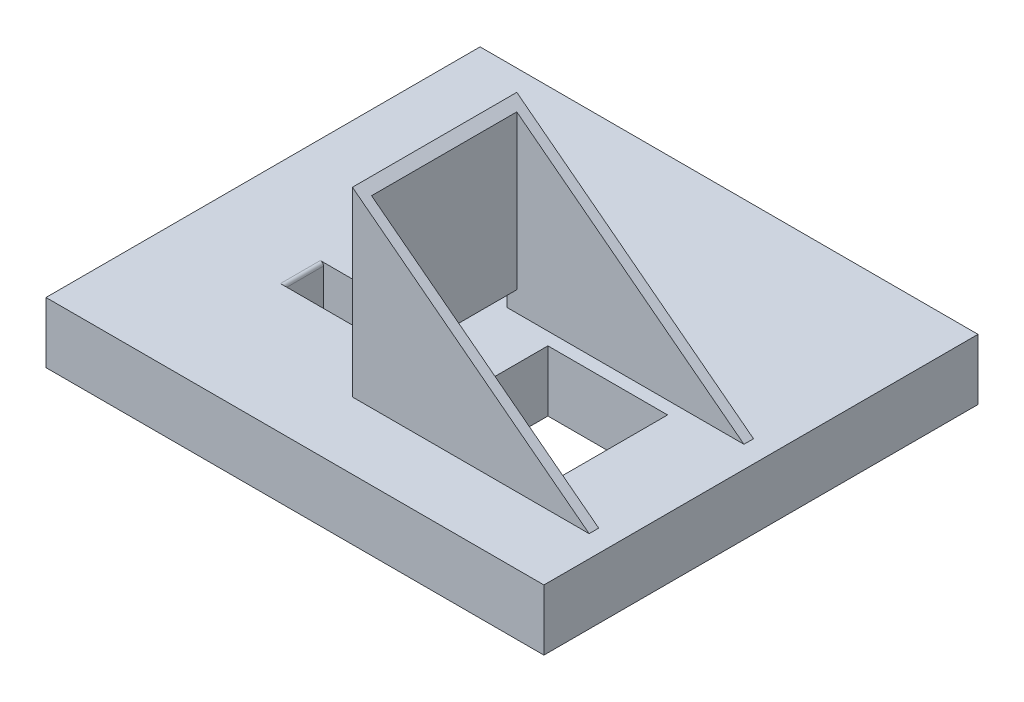
ISO-10303-21;
HEADER;
FILE_DESCRIPTION(('STEP AP214'),'2;1');
FILE_NAME('part.step','',(''),(''),'','','');
FILE_SCHEMA(('AUTOMOTIVE_DESIGN { 1 0 10303 214 1 1 1 1 }'));
ENDSEC;
DATA;
#1=APPLICATION_CONTEXT('core data for automotive mechanical design processes');
#2=APPLICATION_PROTOCOL_DEFINITION('international standard','automotive_design',2000,#1);
#3=PRODUCT_CONTEXT('',#1,'mechanical');
#4=PRODUCT('Part','Part','',(#3));
#5=PRODUCT_RELATED_PRODUCT_CATEGORY('part','',(#4));
#6=PRODUCT_DEFINITION_FORMATION('','',#4);
#7=PRODUCT_DEFINITION_CONTEXT('part definition',#1,'design');
#8=PRODUCT_DEFINITION('design','',#6,#7);
#9=PRODUCT_DEFINITION_SHAPE('','',#8);
#10=(LENGTH_UNIT() NAMED_UNIT(*) SI_UNIT(.MILLI.,.METRE.));
#11=(NAMED_UNIT(*) PLANE_ANGLE_UNIT() SI_UNIT($,.RADIAN.));
#12=(NAMED_UNIT(*) SI_UNIT($,.STERADIAN.) SOLID_ANGLE_UNIT());
#13=UNCERTAINTY_MEASURE_WITH_UNIT(LENGTH_MEASURE(1.E-05),#10,'distance_accuracy_value','');
#14=(GEOMETRIC_REPRESENTATION_CONTEXT(3) GLOBAL_UNCERTAINTY_ASSIGNED_CONTEXT((#13)) GLOBAL_UNIT_ASSIGNED_CONTEXT((#10,
#11,#12)) REPRESENTATION_CONTEXT('',''));
#15=CARTESIAN_POINT('',(0.,0.,0.));
#16=DIRECTION('',(0.,0.,1.));
#17=DIRECTION('',(1.,0.,0.));
#18=AXIS2_PLACEMENT_3D('',#15,#16,#17);
#19=CARTESIAN_POINT('',(-78.,19.05,68.));
#20=DIRECTION('',(0.,0.,-1.));
#21=DIRECTION('',(-1.,0.,0.));
#22=AXIS2_PLACEMENT_3D('',#19,#20,#21);
#23=PLANE('',#22);
#24=DIRECTION('',(1.,0.,0.));
#25=VECTOR('',#24,1.);
#26=CARTESIAN_POINT('',(-78.,0.,68.));
#27=LINE('',#26,#25);
#28=CARTESIAN_POINT('',(-78.,0.,68.));
#29=VERTEX_POINT('',#28);
#30=CARTESIAN_POINT('',(78.,0.,68.));
#31=VERTEX_POINT('',#30);
#32=EDGE_CURVE('E302',#29,#31,#27,.T.);
#33=ORIENTED_EDGE('',*,*,#32,.T.);
#34=DIRECTION('',(0.,-1.,0.));
#35=VECTOR('',#34,1.);
#36=CARTESIAN_POINT('',(78.,19.05,68.));
#37=LINE('',#36,#35);
#38=CARTESIAN_POINT('',(78.,19.05,68.));
#39=VERTEX_POINT('',#38);
#40=EDGE_CURVE('E337',#39,#31,#37,.T.);
#41=ORIENTED_EDGE('',*,*,#40,.F.);
#42=DIRECTION('',(1.,0.,0.));
#43=VECTOR('',#42,1.);
#44=CARTESIAN_POINT('',(-78.,19.05,68.));
#45=LINE('',#44,#43);
#46=CARTESIAN_POINT('',(-78.,19.05,68.));
#47=VERTEX_POINT('',#46);
#48=EDGE_CURVE('E309',#47,#39,#45,.T.);
#49=ORIENTED_EDGE('',*,*,#48,.F.);
#50=DIRECTION('',(0.,-1.,0.));
#51=VECTOR('',#50,1.);
#52=CARTESIAN_POINT('',(-78.,19.05,68.));
#53=LINE('',#52,#51);
#54=EDGE_CURVE('E321',#47,#29,#53,.T.);
#55=ORIENTED_EDGE('',*,*,#54,.T.);
#56=EDGE_LOOP('',(#33,#41,#49,#55));
#57=FACE_BOUND('',#56,.T.);
#58=ADVANCED_FACE('F33',(#57),#23,.F.);
#59=CARTESIAN_POINT('',(78.,19.05,68.));
#60=DIRECTION('',(-1.,0.,0.));
#61=DIRECTION('',(0.,0.,1.));
#62=AXIS2_PLACEMENT_3D('',#59,#60,#61);
#63=PLANE('',#62);
#64=DIRECTION('',(0.,0.,-1.));
#65=VECTOR('',#64,1.);
#66=CARTESIAN_POINT('',(78.,0.,68.));
#67=LINE('',#66,#65);
#68=CARTESIAN_POINT('',(78.,0.,-68.));
#69=VERTEX_POINT('',#68);
#70=EDGE_CURVE('E324',#31,#69,#67,.T.);
#71=ORIENTED_EDGE('',*,*,#70,.T.);
#72=DIRECTION('',(0.,-1.,0.));
#73=VECTOR('',#72,1.);
#74=CARTESIAN_POINT('',(78.,19.05,-68.));
#75=LINE('',#74,#73);
#76=CARTESIAN_POINT('',(78.,19.05,-68.));
#77=VERTEX_POINT('',#76);
#78=EDGE_CURVE('E335',#77,#69,#75,.T.);
#79=ORIENTED_EDGE('',*,*,#78,.F.);
#80=DIRECTION('',(0.,0.,-1.));
#81=VECTOR('',#80,1.);
#82=CARTESIAN_POINT('',(78.,19.05,68.));
#83=LINE('',#82,#81);
#84=EDGE_CURVE('E312',#39,#77,#83,.T.);
#85=ORIENTED_EDGE('',*,*,#84,.F.);
#86=ORIENTED_EDGE('',*,*,#40,.T.);
#87=EDGE_LOOP('',(#71,#79,#85,#86));
#88=FACE_BOUND('',#87,.T.);
#89=ADVANCED_FACE('F393',(#88),#63,.F.);
#90=CARTESIAN_POINT('',(-78.,19.05,-68.));
#91=DIRECTION('',(0.,0.,-1.));
#92=DIRECTION('',(-1.,0.,0.));
#93=AXIS2_PLACEMENT_3D('',#90,#91,#92);
#94=PLANE('',#93);
#95=DIRECTION('',(1.,0.,0.));
#96=VECTOR('',#95,1.);
#97=CARTESIAN_POINT('',(-78.,0.,-68.));
#98=LINE('',#97,#96);
#99=CARTESIAN_POINT('',(-78.,0.,-68.));
#100=VERTEX_POINT('',#99);
#101=EDGE_CURVE('E327',#100,#69,#98,.T.);
#102=ORIENTED_EDGE('',*,*,#101,.F.);
#103=DIRECTION('',(0.,-1.,0.));
#104=VECTOR('',#103,1.);
#105=CARTESIAN_POINT('',(-78.,19.05,-68.));
#106=LINE('',#105,#104);
#107=CARTESIAN_POINT('',(-78.,19.05,-68.));
#108=VERTEX_POINT('',#107);
#109=EDGE_CURVE('E333',#108,#100,#106,.T.);
#110=ORIENTED_EDGE('',*,*,#109,.F.);
#111=DIRECTION('',(1.,0.,0.));
#112=VECTOR('',#111,1.);
#113=CARTESIAN_POINT('',(-78.,19.05,-68.));
#114=LINE('',#113,#112);
#115=EDGE_CURVE('E315',#108,#77,#114,.T.);
#116=ORIENTED_EDGE('',*,*,#115,.T.);
#117=ORIENTED_EDGE('',*,*,#78,.T.);
#118=EDGE_LOOP('',(#102,#110,#116,#117));
#119=FACE_BOUND('',#118,.T.);
#120=ADVANCED_FACE('F399',(#119),#94,.T.);
#121=CARTESIAN_POINT('',(-78.,19.05,68.));
#122=DIRECTION('',(-1.,0.,0.));
#123=DIRECTION('',(0.,0.,1.));
#124=AXIS2_PLACEMENT_3D('',#121,#122,#123);
#125=PLANE('',#124);
#126=DIRECTION('',(0.,0.,-1.));
#127=VECTOR('',#126,1.);
#128=CARTESIAN_POINT('',(-78.,0.,68.));
#129=LINE('',#128,#127);
#130=EDGE_CURVE('E313',#29,#100,#129,.T.);
#131=ORIENTED_EDGE('',*,*,#130,.F.);
#132=ORIENTED_EDGE('',*,*,#54,.F.);
#133=DIRECTION('',(0.,0.,-1.));
#134=VECTOR('',#133,1.);
#135=CARTESIAN_POINT('',(-78.,19.05,68.));
#136=LINE('',#135,#134);
#137=EDGE_CURVE('E318',#47,#108,#136,.T.);
#138=ORIENTED_EDGE('',*,*,#137,.T.);
#139=ORIENTED_EDGE('',*,*,#109,.T.);
#140=EDGE_LOOP('',(#131,#132,#138,#139));
#141=FACE_BOUND('',#140,.T.);
#142=ADVANCED_FACE('F405',(#141),#125,.T.);
#143=CARTESIAN_POINT('',(0.,19.05,0.));
#144=DIRECTION('',(0.,1.,0.));
#145=DIRECTION('',(0.,0.,1.));
#146=AXIS2_PLACEMENT_3D('',#143,#144,#145);
#147=PLANE('',#146);
#148=DIRECTION('',(0.,0.,1.));
#149=VECTOR('',#148,1.);
#150=CARTESIAN_POINT('',(-2.99999999999994,19.05,-4.49999999999998));
#151=LINE('',#150,#149);
#152=CARTESIAN_POINT('',(-2.99999999999993,19.05,44.));
#153=VERTEX_POINT('',#152);
#154=CARTESIAN_POINT('',(-2.99999999999993,19.05,47.));
#155=VERTEX_POINT('',#154);
#156=EDGE_CURVE('E233',#153,#155,#151,.T.);
#157=ORIENTED_EDGE('',*,*,#156,.F.);
#158=DIRECTION('',(1.,0.,0.));
#159=VECTOR('',#158,1.);
#160=CARTESIAN_POINT('',(0.,19.05,44.));
#161=LINE('',#160,#159);
#162=CARTESIAN_POINT('',(71.1637758980097,19.05,44.));
#163=VERTEX_POINT('',#162);
#164=EDGE_CURVE('E236',#153,#163,#161,.T.);
#165=ORIENTED_EDGE('',*,*,#164,.T.);
#166=DIRECTION('',(0.,0.,1.));
#167=VECTOR('',#166,1.);
#168=CARTESIAN_POINT('',(71.1637758980097,19.05,0.));
#169=LINE('',#168,#167);
#170=CARTESIAN_POINT('',(71.1637758980097,19.05,47.));
#171=VERTEX_POINT('',#170);
#172=EDGE_CURVE('E220',#163,#171,#169,.T.);
#173=ORIENTED_EDGE('',*,*,#172,.T.);
#174=DIRECTION('',(1.,0.,0.));
#175=VECTOR('',#174,1.);
#176=CARTESIAN_POINT('',(-2.99999999999993,19.05,47.));
#177=LINE('',#176,#175);
#178=EDGE_CURVE('E56',#155,#171,#177,.T.);
#179=ORIENTED_EDGE('',*,*,#178,.F.);
#180=EDGE_LOOP('',(#157,#165,#173,#179));
#181=FACE_BOUND('',#180,.T.);
#182=DIRECTION('',(1.,0.,0.));
#183=VECTOR('',#182,1.);
#184=CARTESIAN_POINT('',(-2.99999999999994,19.05,-4.49999999999998));
#185=LINE('',#184,#183);
#186=CARTESIAN_POINT('',(-2.99999999999994,19.05,-4.49999999999998));
#187=VERTEX_POINT('',#186);
#188=CARTESIAN_POINT('',(71.1637758980098,19.05,-4.49999999999997));
#189=VERTEX_POINT('',#188);
#190=EDGE_CURVE('E230',#187,#189,#185,.T.);
#191=ORIENTED_EDGE('',*,*,#190,.T.);
#192=CARTESIAN_POINT('',(71.1637758980097,19.05,-1.49999999999998));
#193=VERTEX_POINT('',#192);
#194=EDGE_CURVE('E225',#189,#193,#169,.T.);
#195=ORIENTED_EDGE('',*,*,#194,.T.);
#196=DIRECTION('',(1.,0.,0.));
#197=VECTOR('',#196,1.);
#198=CARTESIAN_POINT('',(0.,19.05,-1.49999999999997));
#199=LINE('',#198,#197);
#200=CARTESIAN_POINT('',(-2.99999999999993,19.05,-1.49999999999997));
#201=VERTEX_POINT('',#200);
#202=EDGE_CURVE('E203',#201,#193,#199,.T.);
#203=ORIENTED_EDGE('',*,*,#202,.F.);
#204=EDGE_CURVE('E207',#187,#201,#151,.T.);
#205=ORIENTED_EDGE('',*,*,#204,.F.);
#206=EDGE_LOOP('',(#191,#195,#203,#205));
#207=FACE_BOUND('',#206,.T.);
#208=DIRECTION('',(1.,0.,0.));
#209=VECTOR('',#208,1.);
#210=CARTESIAN_POINT('',(-44.05,19.05,27.5));
#211=LINE('',#210,#209);
#212=CARTESIAN_POINT('',(-45.05,19.05,27.5));
#213=VERTEX_POINT('',#212);
#214=CARTESIAN_POINT('',(-20.25,19.05,27.5));
#215=VERTEX_POINT('',#214);
#216=EDGE_CURVE('E215',#213,#215,#211,.T.);
#217=ORIENTED_EDGE('',*,*,#216,.F.);
#218=DIRECTION('',(0.,0.,1.));
#219=VECTOR('',#218,1.);
#220=CARTESIAN_POINT('',(-45.05,19.05,15.));
#221=LINE('',#220,#219);
#222=CARTESIAN_POINT('',(-45.05,19.05,15.));
#223=VERTEX_POINT('',#222);
#224=EDGE_CURVE('E346',#213,#223,#221,.F.);
#225=ORIENTED_EDGE('',*,*,#224,.T.);
#226=DIRECTION('',(-1.,0.,0.));
#227=VECTOR('',#226,1.);
#228=CARTESIAN_POINT('',(-44.05,19.05,15.));
#229=LINE('',#228,#227);
#230=CARTESIAN_POINT('',(-20.25,19.05,15.));
#231=VERTEX_POINT('',#230);
#232=EDGE_CURVE('E253',#231,#223,#229,.T.);
#233=ORIENTED_EDGE('',*,*,#232,.F.);
#234=DIRECTION('',(0.,0.,-1.));
#235=VECTOR('',#234,1.);
#236=CARTESIAN_POINT('',(-20.25,19.05,27.5));
#237=LINE('',#236,#235);
#238=EDGE_CURVE('E343',#231,#215,#237,.F.);
#239=ORIENTED_EDGE('',*,*,#238,.T.);
#240=EDGE_LOOP('',(#217,#225,#233,#239));
#241=FACE_BOUND('',#240,.T.);
#242=DIRECTION('',(0.,0.,-1.));
#243=VECTOR('',#242,1.);
#244=CARTESIAN_POINT('',(51.2499999999999,19.05,40.));
#245=LINE('',#244,#243);
#246=CARTESIAN_POINT('',(51.2499999999999,19.05,40.));
#247=VERTEX_POINT('',#246);
#248=CARTESIAN_POINT('',(51.25,19.05,2.50000000000002));
#249=VERTEX_POINT('',#248);
#250=EDGE_CURVE('E268',#247,#249,#245,.T.);
#251=ORIENTED_EDGE('',*,*,#250,.F.);
#252=DIRECTION('',(1.,0.,0.));
#253=VECTOR('',#252,1.);
#254=CARTESIAN_POINT('',(51.2499999999999,19.05,40.));
#255=LINE('',#254,#253);
#256=CARTESIAN_POINT('',(13.75,19.05,40.));
#257=VERTEX_POINT('',#256);
#258=EDGE_CURVE('E281',#257,#247,#255,.T.);
#259=ORIENTED_EDGE('',*,*,#258,.F.);
#260=DIRECTION('',(0.,0.,1.));
#261=VECTOR('',#260,1.);
#262=CARTESIAN_POINT('',(13.75,19.05,40.));
#263=LINE('',#262,#261);
#264=CARTESIAN_POINT('',(13.75,19.05,2.50000000000003));
#265=VERTEX_POINT('',#264);
#266=EDGE_CURVE('E295',#265,#257,#263,.T.);
#267=ORIENTED_EDGE('',*,*,#266,.F.);
#268=DIRECTION('',(-1.,0.,0.));
#269=VECTOR('',#268,1.);
#270=CARTESIAN_POINT('',(51.25,19.05,2.50000000000002));
#271=LINE('',#270,#269);
#272=EDGE_CURVE('E292',#249,#265,#271,.T.);
#273=ORIENTED_EDGE('',*,*,#272,.F.);
#274=EDGE_LOOP('',(#251,#259,#267,#273));
#275=FACE_BOUND('',#274,.T.);
#276=ORIENTED_EDGE('',*,*,#48,.T.);
#277=ORIENTED_EDGE('',*,*,#84,.T.);
#278=ORIENTED_EDGE('',*,*,#115,.F.);
#279=ORIENTED_EDGE('',*,*,#137,.F.);
#280=EDGE_LOOP('',(#276,#277,#278,#279));
#281=FACE_BOUND('',#280,.T.);
#282=ADVANCED_FACE('F365',(#181,#207,#241,#275,#281),#147,.T.);
#283=CARTESIAN_POINT('',(0.,0.,0.));
#284=DIRECTION('',(0.,1.,0.));
#285=DIRECTION('',(0.,0.,1.));
#286=AXIS2_PLACEMENT_3D('',#283,#284,#285);
#287=PLANE('',#286);
#288=DIRECTION('',(-1.,0.,0.));
#289=VECTOR('',#288,1.);
#290=CARTESIAN_POINT('',(-44.05,0.,15.));
#291=LINE('',#290,#289);
#292=CARTESIAN_POINT('',(-21.25,0.,15.));
#293=VERTEX_POINT('',#292);
#294=CARTESIAN_POINT('',(-44.05,0.,15.));
#295=VERTEX_POINT('',#294);
#296=EDGE_CURVE('E259',#293,#295,#291,.T.);
#297=ORIENTED_EDGE('',*,*,#296,.T.);
#298=DIRECTION('',(0.,0.,1.));
#299=VECTOR('',#298,1.);
#300=CARTESIAN_POINT('',(-44.05,0.,27.5));
#301=LINE('',#300,#299);
#302=CARTESIAN_POINT('',(-44.05,0.,27.5));
#303=VERTEX_POINT('',#302);
#304=EDGE_CURVE('E249',#295,#303,#301,.T.);
#305=ORIENTED_EDGE('',*,*,#304,.T.);
#306=DIRECTION('',(1.,0.,0.));
#307=VECTOR('',#306,1.);
#308=CARTESIAN_POINT('',(-44.05,0.,27.5));
#309=LINE('',#308,#307);
#310=CARTESIAN_POINT('',(-21.25,0.,27.5));
#311=VERTEX_POINT('',#310);
#312=EDGE_CURVE('E252',#303,#311,#309,.T.);
#313=ORIENTED_EDGE('',*,*,#312,.T.);
#314=DIRECTION('',(0.,0.,-1.));
#315=VECTOR('',#314,1.);
#316=CARTESIAN_POINT('',(-21.25,0.,27.5));
#317=LINE('',#316,#315);
#318=EDGE_CURVE('E256',#311,#293,#317,.T.);
#319=ORIENTED_EDGE('',*,*,#318,.T.);
#320=EDGE_LOOP('',(#297,#305,#313,#319));
#321=FACE_BOUND('',#320,.T.);
#322=DIRECTION('',(1.,0.,0.));
#323=VECTOR('',#322,1.);
#324=CARTESIAN_POINT('',(51.2499999999999,0.,40.));
#325=LINE('',#324,#323);
#326=CARTESIAN_POINT('',(13.75,0.,40.));
#327=VERTEX_POINT('',#326);
#328=CARTESIAN_POINT('',(51.2499999999999,0.,40.));
#329=VERTEX_POINT('',#328);
#330=EDGE_CURVE('E287',#327,#329,#325,.T.);
#331=ORIENTED_EDGE('',*,*,#330,.T.);
#332=DIRECTION('',(0.,0.,-1.));
#333=VECTOR('',#332,1.);
#334=CARTESIAN_POINT('',(51.2499999999999,0.,40.));
#335=LINE('',#334,#333);
#336=CARTESIAN_POINT('',(51.25,0.,2.50000000000002));
#337=VERTEX_POINT('',#336);
#338=EDGE_CURVE('E277',#329,#337,#335,.T.);
#339=ORIENTED_EDGE('',*,*,#338,.T.);
#340=DIRECTION('',(-1.,0.,0.));
#341=VECTOR('',#340,1.);
#342=CARTESIAN_POINT('',(51.25,0.,2.50000000000002));
#343=LINE('',#342,#341);
#344=CARTESIAN_POINT('',(13.75,0.,2.50000000000003));
#345=VERTEX_POINT('',#344);
#346=EDGE_CURVE('E280',#337,#345,#343,.T.);
#347=ORIENTED_EDGE('',*,*,#346,.T.);
#348=DIRECTION('',(0.,0.,1.));
#349=VECTOR('',#348,1.);
#350=CARTESIAN_POINT('',(13.75,0.,40.));
#351=LINE('',#350,#349);
#352=EDGE_CURVE('E284',#345,#327,#351,.T.);
#353=ORIENTED_EDGE('',*,*,#352,.T.);
#354=EDGE_LOOP('',(#331,#339,#347,#353));
#355=FACE_BOUND('',#354,.T.);
#356=ORIENTED_EDGE('',*,*,#32,.F.);
#357=ORIENTED_EDGE('',*,*,#130,.T.);
#358=ORIENTED_EDGE('',*,*,#101,.T.);
#359=ORIENTED_EDGE('',*,*,#70,.F.);
#360=EDGE_LOOP('',(#356,#357,#358,#359));
#361=FACE_BOUND('',#360,.T.);
#362=ADVANCED_FACE('F377',(#321,#355,#361),#287,.F.);
#363=CARTESIAN_POINT('',(51.2499999999999,0.,40.));
#364=DIRECTION('',(1.,0.,0.));
#365=DIRECTION('',(0.,0.,-1.));
#366=AXIS2_PLACEMENT_3D('',#363,#364,#365);
#367=PLANE('',#366);
#368=ORIENTED_EDGE('',*,*,#250,.T.);
#369=DIRECTION('',(0.,1.,0.));
#370=VECTOR('',#369,1.);
#371=CARTESIAN_POINT('',(51.25,0.,2.50000000000002));
#372=LINE('',#371,#370);
#373=EDGE_CURVE('E290',#337,#249,#372,.T.);
#374=ORIENTED_EDGE('',*,*,#373,.F.);
#375=ORIENTED_EDGE('',*,*,#338,.F.);
#376=DIRECTION('',(0.,1.,0.));
#377=VECTOR('',#376,1.);
#378=CARTESIAN_POINT('',(51.2499999999999,0.,40.));
#379=LINE('',#378,#377);
#380=EDGE_CURVE('E300',#329,#247,#379,.T.);
#381=ORIENTED_EDGE('',*,*,#380,.T.);
#382=EDGE_LOOP('',(#368,#374,#375,#381));
#383=FACE_BOUND('',#382,.T.);
#384=ADVANCED_FACE('F412',(#383),#367,.F.);
#385=CARTESIAN_POINT('',(51.2499999999999,0.,40.));
#386=DIRECTION('',(0.,0.,1.));
#387=DIRECTION('',(1.,0.,0.));
#388=AXIS2_PLACEMENT_3D('',#385,#386,#387);
#389=PLANE('',#388);
#390=ORIENTED_EDGE('',*,*,#258,.T.);
#391=ORIENTED_EDGE('',*,*,#380,.F.);
#392=ORIENTED_EDGE('',*,*,#330,.F.);
#393=DIRECTION('',(0.,1.,0.));
#394=VECTOR('',#393,1.);
#395=CARTESIAN_POINT('',(13.75,0.,40.));
#396=LINE('',#395,#394);
#397=EDGE_CURVE('E303',#327,#257,#396,.T.);
#398=ORIENTED_EDGE('',*,*,#397,.T.);
#399=EDGE_LOOP('',(#390,#391,#392,#398));
#400=FACE_BOUND('',#399,.T.);
#401=ADVANCED_FACE('F418',(#400),#389,.F.);
#402=CARTESIAN_POINT('',(13.75,0.,40.));
#403=DIRECTION('',(-1.,0.,0.));
#404=DIRECTION('',(0.,0.,1.));
#405=AXIS2_PLACEMENT_3D('',#402,#403,#404);
#406=PLANE('',#405);
#407=ORIENTED_EDGE('',*,*,#266,.T.);
#408=ORIENTED_EDGE('',*,*,#397,.F.);
#409=ORIENTED_EDGE('',*,*,#352,.F.);
#410=DIRECTION('',(0.,1.,0.));
#411=VECTOR('',#410,1.);
#412=CARTESIAN_POINT('',(13.75,0.,2.50000000000003));
#413=LINE('',#412,#411);
#414=EDGE_CURVE('E305',#345,#265,#413,.T.);
#415=ORIENTED_EDGE('',*,*,#414,.T.);
#416=EDGE_LOOP('',(#407,#408,#409,#415));
#417=FACE_BOUND('',#416,.T.);
#418=ADVANCED_FACE('F423',(#417),#406,.F.);
#419=CARTESIAN_POINT('',(51.25,0.,2.50000000000002));
#420=DIRECTION('',(0.,0.,-1.));
#421=DIRECTION('',(-1.,0.,0.));
#422=AXIS2_PLACEMENT_3D('',#419,#420,#421);
#423=PLANE('',#422);
#424=ORIENTED_EDGE('',*,*,#272,.T.);
#425=ORIENTED_EDGE('',*,*,#414,.F.);
#426=ORIENTED_EDGE('',*,*,#346,.F.);
#427=ORIENTED_EDGE('',*,*,#373,.T.);
#428=EDGE_LOOP('',(#424,#425,#426,#427));
#429=FACE_BOUND('',#428,.T.);
#430=ADVANCED_FACE('F420',(#429),#423,.F.);
#431=CARTESIAN_POINT('',(-44.05,0.,27.5));
#432=DIRECTION('',(-1.,0.,0.));
#433=DIRECTION('',(0.,0.,1.));
#434=AXIS2_PLACEMENT_3D('',#431,#432,#433);
#435=PLANE('',#434);
#436=DIRECTION('',(0.,1.,0.));
#437=VECTOR('',#436,1.);
#438=CARTESIAN_POINT('',(-44.05,0.,15.));
#439=LINE('',#438,#437);
#440=CARTESIAN_POINT('',(-44.05,18.05,15.));
#441=VERTEX_POINT('',#440);
#442=EDGE_CURVE('E265',#295,#441,#439,.T.);
#443=ORIENTED_EDGE('',*,*,#442,.T.);
#444=DIRECTION('',(0.,0.,1.));
#445=VECTOR('',#444,1.);
#446=CARTESIAN_POINT('',(-44.05,18.05,27.5));
#447=LINE('',#446,#445);
#448=CARTESIAN_POINT('',(-44.05,18.05,27.5));
#449=VERTEX_POINT('',#448);
#450=EDGE_CURVE('E340',#441,#449,#447,.T.);
#451=ORIENTED_EDGE('',*,*,#450,.T.);
#452=DIRECTION('',(0.,1.,0.));
#453=VECTOR('',#452,1.);
#454=CARTESIAN_POINT('',(-44.05,0.,27.5));
#455=LINE('',#454,#453);
#456=EDGE_CURVE('E262',#303,#449,#455,.T.);
#457=ORIENTED_EDGE('',*,*,#456,.F.);
#458=ORIENTED_EDGE('',*,*,#304,.F.);
#459=EDGE_LOOP('',(#443,#451,#457,#458));
#460=FACE_BOUND('',#459,.T.);
#461=ADVANCED_FACE('F374',(#460),#435,.F.);
#462=CARTESIAN_POINT('',(-44.05,0.,15.));
#463=DIRECTION('',(0.,0.,-1.));
#464=DIRECTION('',(-1.,0.,0.));
#465=AXIS2_PLACEMENT_3D('',#462,#463,#464);
#466=PLANE('',#465);
#467=ORIENTED_EDGE('',*,*,#232,.T.);
#468=CARTESIAN_POINT('',(-45.05,18.05,15.));
#469=DIRECTION('',(0.,0.,-1.));
#470=DIRECTION('',(-1.,0.,0.));
#471=AXIS2_PLACEMENT_3D('',#468,#469,#470);
#472=CIRCLE('',#471,1.);
#473=EDGE_CURVE('E355',#223,#441,#472,.T.);
#474=ORIENTED_EDGE('',*,*,#473,.T.);
#475=ORIENTED_EDGE('',*,*,#442,.F.);
#476=ORIENTED_EDGE('',*,*,#296,.F.);
#477=DIRECTION('',(0.,1.,0.));
#478=VECTOR('',#477,1.);
#479=CARTESIAN_POINT('',(-21.25,0.,15.));
#480=LINE('',#479,#478);
#481=CARTESIAN_POINT('',(-21.25,18.05,15.));
#482=VERTEX_POINT('',#481);
#483=EDGE_CURVE('E269',#293,#482,#480,.T.);
#484=ORIENTED_EDGE('',*,*,#483,.T.);
#485=CARTESIAN_POINT('',(-20.25,18.05,15.));
#486=DIRECTION('',(0.,0.,-1.));
#487=DIRECTION('',(-1.,0.,0.));
#488=AXIS2_PLACEMENT_3D('',#485,#486,#487);
#489=CIRCLE('',#488,1.);
#490=EDGE_CURVE('E41',#482,#231,#489,.T.);
#491=ORIENTED_EDGE('',*,*,#490,.T.);
#492=EDGE_LOOP('',(#467,#474,#475,#476,#484,#491));
#493=FACE_BOUND('',#492,.T.);
#494=ADVANCED_FACE('F359',(#493),#466,.F.);
#495=CARTESIAN_POINT('',(-21.25,0.,27.5));
#496=DIRECTION('',(1.,0.,0.));
#497=DIRECTION('',(0.,0.,-1.));
#498=AXIS2_PLACEMENT_3D('',#495,#496,#497);
#499=PLANE('',#498);
#500=DIRECTION('',(0.,1.,0.));
#501=VECTOR('',#500,1.);
#502=CARTESIAN_POINT('',(-21.25,0.,27.5));
#503=LINE('',#502,#501);
#504=CARTESIAN_POINT('',(-21.25,18.05,27.5));
#505=VERTEX_POINT('',#504);
#506=EDGE_CURVE('E272',#311,#505,#503,.T.);
#507=ORIENTED_EDGE('',*,*,#506,.T.);
#508=DIRECTION('',(0.,0.,-1.));
#509=VECTOR('',#508,1.);
#510=CARTESIAN_POINT('',(-21.25,18.05,15.));
#511=LINE('',#510,#509);
#512=EDGE_CURVE('E349',#505,#482,#511,.T.);
#513=ORIENTED_EDGE('',*,*,#512,.T.);
#514=ORIENTED_EDGE('',*,*,#483,.F.);
#515=ORIENTED_EDGE('',*,*,#318,.F.);
#516=EDGE_LOOP('',(#507,#513,#514,#515));
#517=FACE_BOUND('',#516,.T.);
#518=ADVANCED_FACE('F381',(#517),#499,.F.);
#519=CARTESIAN_POINT('',(-44.05,0.,27.5));
#520=DIRECTION('',(0.,0.,1.));
#521=DIRECTION('',(1.,0.,0.));
#522=AXIS2_PLACEMENT_3D('',#519,#520,#521);
#523=PLANE('',#522);
#524=ORIENTED_EDGE('',*,*,#216,.T.);
#525=CARTESIAN_POINT('',(-20.25,18.05,27.5));
#526=DIRECTION('',(0.,0.,1.));
#527=DIRECTION('',(1.,0.,0.));
#528=AXIS2_PLACEMENT_3D('',#525,#526,#527);
#529=CIRCLE('',#528,1.);
#530=EDGE_CURVE('E11',#215,#505,#529,.T.);
#531=ORIENTED_EDGE('',*,*,#530,.T.);
#532=ORIENTED_EDGE('',*,*,#506,.F.);
#533=ORIENTED_EDGE('',*,*,#312,.F.);
#534=ORIENTED_EDGE('',*,*,#456,.T.);
#535=CARTESIAN_POINT('',(-45.05,18.05,27.5));
#536=DIRECTION('',(0.,0.,1.));
#537=DIRECTION('',(1.,0.,0.));
#538=AXIS2_PLACEMENT_3D('',#535,#536,#537);
#539=CIRCLE('',#538,1.);
#540=EDGE_CURVE('E352',#449,#213,#539,.T.);
#541=ORIENTED_EDGE('',*,*,#540,.T.);
#542=EDGE_LOOP('',(#524,#531,#532,#533,#534,#541));
#543=FACE_BOUND('',#542,.T.);
#544=ADVANCED_FACE('F383',(#543),#523,.F.);
#545=CARTESIAN_POINT('',(-45.05,18.05,27.5));
#546=DIRECTION('',(0.,0.,-1.));
#547=DIRECTION('',(-1.,0.,0.));
#548=AXIS2_PLACEMENT_3D('',#545,#546,#547);
#549=CYLINDRICAL_SURFACE('',#548,1.);
#550=ORIENTED_EDGE('',*,*,#473,.F.);
#551=ORIENTED_EDGE('',*,*,#224,.F.);
#552=ORIENTED_EDGE('',*,*,#540,.F.);
#553=ORIENTED_EDGE('',*,*,#450,.F.);
#554=EDGE_LOOP('',(#550,#551,#552,#553));
#555=FACE_BOUND('',#554,.T.);
#556=ADVANCED_FACE('F371',(#555),#549,.T.);
#557=CARTESIAN_POINT('',(-20.25,18.05,27.5));
#558=DIRECTION('',(0.,0.,1.));
#559=DIRECTION('',(1.,0.,0.));
#560=AXIS2_PLACEMENT_3D('',#557,#558,#559);
#561=CYLINDRICAL_SURFACE('',#560,1.);
#562=ORIENTED_EDGE('',*,*,#530,.F.);
#563=ORIENTED_EDGE('',*,*,#238,.F.);
#564=ORIENTED_EDGE('',*,*,#490,.F.);
#565=ORIENTED_EDGE('',*,*,#512,.F.);
#566=EDGE_LOOP('',(#562,#563,#564,#565));
#567=FACE_BOUND('',#566,.T.);
#568=ADVANCED_FACE('F35',(#567),#561,.T.);
#569=CARTESIAN_POINT('',(0.,153.367610149503,-1.49999999999997));
#570=DIRECTION('',(1.,0.,0.));
#571=DIRECTION('',(0.,0.,-1.));
#572=AXIS2_PLACEMENT_3D('',#569,#570,#571);
#573=PLANE('',#572);
#574=DIRECTION('',(0.,0.,1.));
#575=VECTOR('',#574,1.);
#576=CARTESIAN_POINT('',(0.,25.4,-1.49999999999997));
#577=LINE('',#576,#575);
#578=CARTESIAN_POINT('',(0.,25.4,-1.49999999999997));
#579=VERTEX_POINT('',#578);
#580=CARTESIAN_POINT('',(0.,25.4,44.));
#581=VERTEX_POINT('',#580);
#582=EDGE_CURVE('E197',#579,#581,#577,.T.);
#583=ORIENTED_EDGE('',*,*,#582,.F.);
#584=DIRECTION('',(0.,-1.,0.));
#585=VECTOR('',#584,1.);
#586=CARTESIAN_POINT('',(0.,153.367610149503,-1.49999999999997));
#587=LINE('',#586,#585);
#588=CARTESIAN_POINT('',(0.,73.6558858130298,-1.49999999999997));
#589=VERTEX_POINT('',#588);
#590=EDGE_CURVE('E192',#589,#579,#587,.T.);
#591=ORIENTED_EDGE('',*,*,#590,.F.);
#592=DIRECTION('',(0.,0.,-1.));
#593=VECTOR('',#592,1.);
#594=CARTESIAN_POINT('',(0.,73.6558858130298,-1.49999999999998));
#595=LINE('',#594,#593);
#596=CARTESIAN_POINT('',(0.,73.6558858130298,44.));
#597=VERTEX_POINT('',#596);
#598=EDGE_CURVE('E216',#597,#589,#595,.T.);
#599=ORIENTED_EDGE('',*,*,#598,.F.);
#600=DIRECTION('',(0.,-1.,0.));
#601=VECTOR('',#600,1.);
#602=CARTESIAN_POINT('',(0.,153.367610149503,44.));
#603=LINE('',#602,#601);
#604=EDGE_CURVE('E240',#597,#581,#603,.T.);
#605=ORIENTED_EDGE('',*,*,#604,.T.);
#606=EDGE_LOOP('',(#583,#591,#599,#605));
#607=FACE_BOUND('',#606,.T.);
#608=ADVANCED_FACE('F453',(#607),#573,.T.);
#609=CARTESIAN_POINT('',(0.,153.367610149503,44.));
#610=DIRECTION('',(0.,0.,-1.));
#611=DIRECTION('',(-1.,0.,0.));
#612=AXIS2_PLACEMENT_3D('',#609,#610,#611);
#613=PLANE('',#612);
#614=DIRECTION('',(-0.793353340291234,0.608761429008722,0.));
#615=VECTOR('',#614,1.);
#616=CARTESIAN_POINT('',(-38.4978065973171,103.196291793146,44.));
#617=LINE('',#616,#615);
#618=EDGE_CURVE('E213',#163,#597,#617,.T.);
#619=ORIENTED_EDGE('',*,*,#618,.F.);
#620=ORIENTED_EDGE('',*,*,#164,.F.);
#621=DIRECTION('',(0.,1.,0.));
#622=VECTOR('',#621,1.);
#623=CARTESIAN_POINT('',(-2.99999999999993,19.05,44.));
#624=LINE('',#623,#622);
#625=CARTESIAN_POINT('',(-2.99999999999993,25.4,44.));
#626=VERTEX_POINT('',#625);
#627=EDGE_CURVE('E48',#153,#626,#624,.T.);
#628=ORIENTED_EDGE('',*,*,#627,.T.);
#629=DIRECTION('',(1.,0.,0.));
#630=VECTOR('',#629,1.);
#631=CARTESIAN_POINT('',(-78.001,25.4,44.));
#632=LINE('',#631,#630);
#633=EDGE_CURVE('E196',#626,#581,#632,.T.);
#634=ORIENTED_EDGE('',*,*,#633,.T.);
#635=ORIENTED_EDGE('',*,*,#604,.F.);
#636=EDGE_LOOP('',(#619,#620,#628,#634,#635));
#637=FACE_BOUND('',#636,.T.);
#638=ADVANCED_FACE('F450',(#637),#613,.T.);
#639=CARTESIAN_POINT('',(-2.99999999999993,153.367610149503,47.));
#640=DIRECTION('',(0.,0.,-1.));
#641=DIRECTION('',(-1.,0.,0.));
#642=AXIS2_PLACEMENT_3D('',#639,#640,#641);
#643=PLANE('',#642);
#644=ORIENTED_EDGE('',*,*,#178,.T.);
#645=DIRECTION('',(-0.793353340291234,0.608761429008722,0.));
#646=VECTOR('',#645,1.);
#647=CARTESIAN_POINT('',(-40.3860351649708,104.645180532579,47.));
#648=LINE('',#647,#646);
#649=CARTESIAN_POINT('',(-2.99999999999994,75.9578667769666,47.));
#650=VERTEX_POINT('',#649);
#651=EDGE_CURVE('E217',#171,#650,#648,.T.);
#652=ORIENTED_EDGE('',*,*,#651,.T.);
#653=DIRECTION('',(0.,-1.,0.));
#654=VECTOR('',#653,1.);
#655=CARTESIAN_POINT('',(-2.99999999999993,153.367610149503,47.));
#656=LINE('',#655,#654);
#657=EDGE_CURVE('E243',#650,#155,#656,.T.);
#658=ORIENTED_EDGE('',*,*,#657,.T.);
#659=EDGE_LOOP('',(#644,#652,#658));
#660=FACE_BOUND('',#659,.T.);
#661=ADVANCED_FACE('F447',(#660),#643,.F.);
#662=CARTESIAN_POINT('',(-2.99999999999994,153.367610149503,-4.49999999999998));
#663=DIRECTION('',(1.,0.,0.));
#664=DIRECTION('',(0.,0.,-1.));
#665=AXIS2_PLACEMENT_3D('',#662,#663,#664);
#666=PLANE('',#665);
#667=ORIENTED_EDGE('',*,*,#204,.T.);
#668=DIRECTION('',(0.,-1.,0.));
#669=VECTOR('',#668,1.);
#670=CARTESIAN_POINT('',(-2.99999999999993,19.05,-1.49999999999997));
#671=LINE('',#670,#669);
#672=CARTESIAN_POINT('',(-2.99999999999993,25.4,-1.49999999999997));
#673=VERTEX_POINT('',#672);
#674=EDGE_CURVE('E188',#673,#201,#671,.T.);
#675=ORIENTED_EDGE('',*,*,#674,.F.);
#676=DIRECTION('',(0.,0.,-1.));
#677=VECTOR('',#676,1.);
#678=CARTESIAN_POINT('',(-2.99999999999993,25.4,-1.49999999999997));
#679=LINE('',#678,#677);
#680=EDGE_CURVE('E200',#626,#673,#679,.T.);
#681=ORIENTED_EDGE('',*,*,#680,.F.);
#682=ORIENTED_EDGE('',*,*,#627,.F.);
#683=ORIENTED_EDGE('',*,*,#156,.T.);
#684=ORIENTED_EDGE('',*,*,#657,.F.);
#685=DIRECTION('',(0.,0.,-1.));
#686=VECTOR('',#685,1.);
#687=CARTESIAN_POINT('',(-2.99999999999994,75.9578667769666,-4.49999999999998));
#688=LINE('',#687,#686);
#689=CARTESIAN_POINT('',(-2.99999999999994,75.9578667769666,-4.49999999999998));
#690=VERTEX_POINT('',#689);
#691=EDGE_CURVE('E219',#650,#690,#688,.T.);
#692=ORIENTED_EDGE('',*,*,#691,.T.);
#693=DIRECTION('',(0.,-1.,0.));
#694=VECTOR('',#693,1.);
#695=CARTESIAN_POINT('',(-2.99999999999994,153.367610149503,-4.49999999999998));
#696=LINE('',#695,#694);
#697=EDGE_CURVE('E245',#690,#187,#696,.T.);
#698=ORIENTED_EDGE('',*,*,#697,.T.);
#699=EDGE_LOOP('',(#667,#675,#681,#682,#683,#684,#692,#698));
#700=FACE_BOUND('',#699,.T.);
#701=ADVANCED_FACE('F205',(#700),#666,.F.);
#702=CARTESIAN_POINT('',(-2.99999999999994,153.367610149503,-4.49999999999998));
#703=DIRECTION('',(0.,0.,-1.));
#704=DIRECTION('',(-1.,0.,0.));
#705=AXIS2_PLACEMENT_3D('',#702,#703,#704);
#706=PLANE('',#705);
#707=DIRECTION('',(-0.793353340291234,0.608761429008722,0.));
#708=VECTOR('',#707,1.);
#709=CARTESIAN_POINT('',(-40.3860351649709,104.645180532579,-4.49999999999998));
#710=LINE('',#709,#708);
#711=EDGE_CURVE('E223',#189,#690,#710,.T.);
#712=ORIENTED_EDGE('',*,*,#711,.F.);
#713=ORIENTED_EDGE('',*,*,#190,.F.);
#714=ORIENTED_EDGE('',*,*,#697,.F.);
#715=EDGE_LOOP('',(#712,#713,#714));
#716=FACE_BOUND('',#715,.T.);
#717=ADVANCED_FACE('F441',(#716),#706,.T.);
#718=CARTESIAN_POINT('',(0.,153.367610149503,-1.49999999999997));
#719=DIRECTION('',(0.,0.,-1.));
#720=DIRECTION('',(-1.,0.,0.));
#721=AXIS2_PLACEMENT_3D('',#718,#719,#720);
#722=PLANE('',#721);
#723=ORIENTED_EDGE('',*,*,#202,.T.);
#724=DIRECTION('',(-0.793353340291234,0.608761429008722,0.));
#725=VECTOR('',#724,1.);
#726=CARTESIAN_POINT('',(-38.4978065973171,103.196291793146,-1.49999999999997));
#727=LINE('',#726,#725);
#728=EDGE_CURVE('E227',#193,#589,#727,.T.);
#729=ORIENTED_EDGE('',*,*,#728,.T.);
#730=ORIENTED_EDGE('',*,*,#590,.T.);
#731=DIRECTION('',(1.,0.,0.));
#732=VECTOR('',#731,1.);
#733=CARTESIAN_POINT('',(-78.001,25.4,-1.49999999999996));
#734=LINE('',#733,#732);
#735=EDGE_CURVE('E183',#673,#579,#734,.T.);
#736=ORIENTED_EDGE('',*,*,#735,.F.);
#737=ORIENTED_EDGE('',*,*,#674,.T.);
#738=EDGE_LOOP('',(#723,#729,#730,#736,#737));
#739=FACE_BOUND('',#738,.T.);
#740=ADVANCED_FACE('F186',(#739),#722,.F.);
#741=CARTESIAN_POINT('',(75.4342892824346,15.7731198276054,80.));
#742=DIRECTION('',(-0.608761429008722,-0.793353340291234,0.));
#743=DIRECTION('',(0.793353340291234,-0.608761429008722,0.));
#744=AXIS2_PLACEMENT_3D('',#741,#742,#743);
#745=PLANE('',#744);
#746=ORIENTED_EDGE('',*,*,#194,.F.);
#747=ORIENTED_EDGE('',*,*,#711,.T.);
#748=ORIENTED_EDGE('',*,*,#691,.F.);
#749=ORIENTED_EDGE('',*,*,#651,.F.);
#750=ORIENTED_EDGE('',*,*,#172,.F.);
#751=ORIENTED_EDGE('',*,*,#618,.T.);
#752=ORIENTED_EDGE('',*,*,#598,.T.);
#753=ORIENTED_EDGE('',*,*,#728,.F.);
#754=EDGE_LOOP('',(#746,#747,#748,#749,#750,#751,#752,#753));
#755=FACE_BOUND('',#754,.T.);
#756=ADVANCED_FACE('F440',(#755),#745,.F.);
#757=CARTESIAN_POINT('',(-78.001,25.4,-1.49999999999996));
#758=DIRECTION('',(0.,1.,0.));
#759=DIRECTION('',(0.,0.,1.));
#760=AXIS2_PLACEMENT_3D('',#757,#758,#759);
#761=PLANE('',#760);
#762=ORIENTED_EDGE('',*,*,#680,.T.);
#763=ORIENTED_EDGE('',*,*,#735,.T.);
#764=ORIENTED_EDGE('',*,*,#582,.T.);
#765=ORIENTED_EDGE('',*,*,#633,.F.);
#766=EDGE_LOOP('',(#762,#763,#764,#765));
#767=FACE_BOUND('',#766,.T.);
#768=ADVANCED_FACE('F201',(#767),#761,.F.);
#769=CLOSED_SHELL('',(#58,#89,#120,#142,#282,#362,#384,#401,#418,#430,#461,#494,#518,#544,#556,
#568,#608,#638,#661,#701,#717,#740,#756,#768));
#770=MANIFOLD_SOLID_BREP('B2',#769);
#771=ADVANCED_BREP_SHAPE_REPRESENTATION('',(#18,#770),#14);
#772=SHAPE_DEFINITION_REPRESENTATION(#9,#771);
ENDSEC;
END-ISO-10303-21;
